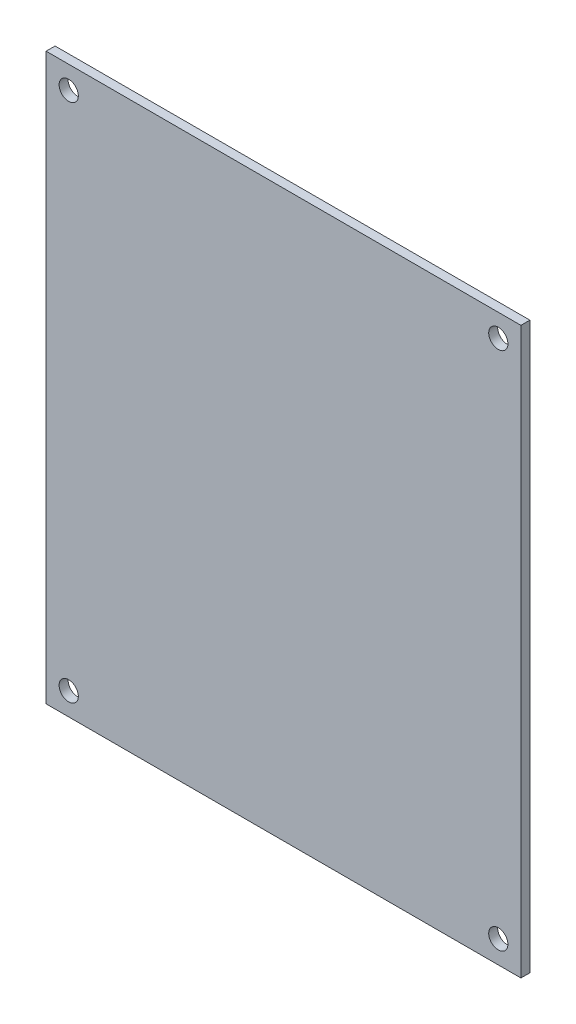
ISO-10303-21;
HEADER;
FILE_DESCRIPTION(('STEP AP214'),'2;1');
FILE_NAME('part.step','',(''),(''),'','','');
FILE_SCHEMA(('AUTOMOTIVE_DESIGN { 1 0 10303 214 1 1 1 1 }'));
ENDSEC;
DATA;
#1=APPLICATION_CONTEXT('core data for automotive mechanical design processes');
#2=APPLICATION_PROTOCOL_DEFINITION('international standard','automotive_design',2000,#1);
#3=PRODUCT_CONTEXT('',#1,'mechanical');
#4=PRODUCT('Part','Part','',(#3));
#5=PRODUCT_RELATED_PRODUCT_CATEGORY('part','',(#4));
#6=PRODUCT_DEFINITION_FORMATION('','',#4);
#7=PRODUCT_DEFINITION_CONTEXT('part definition',#1,'design');
#8=PRODUCT_DEFINITION('design','',#6,#7);
#9=PRODUCT_DEFINITION_SHAPE('','',#8);
#10=(LENGTH_UNIT() NAMED_UNIT(*) SI_UNIT(.MILLI.,.METRE.));
#11=(NAMED_UNIT(*) PLANE_ANGLE_UNIT() SI_UNIT($,.RADIAN.));
#12=(NAMED_UNIT(*) SI_UNIT($,.STERADIAN.) SOLID_ANGLE_UNIT());
#13=UNCERTAINTY_MEASURE_WITH_UNIT(LENGTH_MEASURE(1.E-05),#10,'distance_accuracy_value','');
#14=(GEOMETRIC_REPRESENTATION_CONTEXT(3) GLOBAL_UNCERTAINTY_ASSIGNED_CONTEXT((#13)) GLOBAL_UNIT_ASSIGNED_CONTEXT((#10,
#11,#12)) REPRESENTATION_CONTEXT('',''));
#15=CARTESIAN_POINT('',(0.,0.,0.));
#16=DIRECTION('',(0.,0.,1.));
#17=DIRECTION('',(1.,0.,0.));
#18=AXIS2_PLACEMENT_3D('',#15,#16,#17);
#19=CARTESIAN_POINT('',(41.999999947,-49.999999949,-0.79375));
#20=DIRECTION('',(0.,0.,1.));
#21=DIRECTION('',(1.,0.,0.));
#22=AXIS2_PLACEMENT_3D('',#19,#20,#21);
#23=PLANE('',#22);
#24=CARTESIAN_POINT('',(-37.999999819,-45.999999821,-0.79375));
#25=DIRECTION('',(0.,0.,1.));
#26=DIRECTION('',(1.,0.,0.));
#27=AXIS2_PLACEMENT_3D('',#24,#25,#26);
#28=CIRCLE('',#27,1.700000029);
#29=CARTESIAN_POINT('',(-36.29999979,-45.999999821,-0.79375));
#30=VERTEX_POINT('',#29);
#31=EDGE_CURVE('E121',#30,#30,#28,.T.);
#32=ORIENTED_EDGE('',*,*,#31,.T.);
#33=EDGE_LOOP('',(#32));
#34=FACE_BOUND('',#33,.T.);
#35=CARTESIAN_POINT('',(37.999999819,-45.999999821,-0.79375));
#36=DIRECTION('',(0.,0.,1.));
#37=DIRECTION('',(1.,0.,0.));
#38=AXIS2_PLACEMENT_3D('',#35,#36,#37);
#39=CIRCLE('',#38,1.700000029);
#40=CARTESIAN_POINT('',(39.699999848,-45.999999821,-0.79375));
#41=VERTEX_POINT('',#40);
#42=EDGE_CURVE('E127',#41,#41,#39,.T.);
#43=ORIENTED_EDGE('',*,*,#42,.T.);
#44=EDGE_LOOP('',(#43));
#45=FACE_BOUND('',#44,.T.);
#46=CARTESIAN_POINT('',(37.999999819,45.999999821,-0.79375));
#47=DIRECTION('',(0.,0.,1.));
#48=DIRECTION('',(1.,0.,0.));
#49=AXIS2_PLACEMENT_3D('',#46,#47,#48);
#50=CIRCLE('',#49,1.700000029);
#51=CARTESIAN_POINT('',(39.699999848,45.999999821,-0.79375));
#52=VERTEX_POINT('',#51);
#53=EDGE_CURVE('E115',#52,#52,#50,.T.);
#54=ORIENTED_EDGE('',*,*,#53,.T.);
#55=EDGE_LOOP('',(#54));
#56=FACE_BOUND('',#55,.T.);
#57=CARTESIAN_POINT('',(-37.999999819,45.999999821,-0.79375));
#58=DIRECTION('',(0.,0.,1.));
#59=DIRECTION('',(1.,0.,0.));
#60=AXIS2_PLACEMENT_3D('',#57,#58,#59);
#61=CIRCLE('',#60,1.700000029);
#62=CARTESIAN_POINT('',(-36.29999979,45.999999821,-0.79375));
#63=VERTEX_POINT('',#62);
#64=EDGE_CURVE('E101',#63,#63,#61,.T.);
#65=ORIENTED_EDGE('',*,*,#64,.T.);
#66=EDGE_LOOP('',(#65));
#67=FACE_BOUND('',#66,.T.);
#68=DIRECTION('',(0.,1.,0.));
#69=VECTOR('',#68,1.);
#70=CARTESIAN_POINT('',(-41.999999947,-49.999999949,-0.79375));
#71=LINE('',#70,#69);
#72=CARTESIAN_POINT('',(-41.999999947,-49.999999949,-0.79375));
#73=VERTEX_POINT('',#72);
#74=CARTESIAN_POINT('',(-41.999999947,49.999999949,-0.79375));
#75=VERTEX_POINT('',#74);
#76=EDGE_CURVE('E98',#73,#75,#71,.T.);
#77=ORIENTED_EDGE('',*,*,#76,.T.);
#78=DIRECTION('',(-1.,0.,0.));
#79=VECTOR('',#78,1.);
#80=CARTESIAN_POINT('',(41.999999947,49.999999949,-0.79375));
#81=LINE('',#80,#79);
#82=CARTESIAN_POINT('',(41.999999947,49.999999949,-0.79375));
#83=VERTEX_POINT('',#82);
#84=EDGE_CURVE('E11',#83,#75,#81,.T.);
#85=ORIENTED_EDGE('',*,*,#84,.F.);
#86=DIRECTION('',(0.,1.,0.));
#87=VECTOR('',#86,1.);
#88=CARTESIAN_POINT('',(41.999999947,-49.999999949,-0.79375));
#89=LINE('',#88,#87);
#90=CARTESIAN_POINT('',(41.999999947,-49.999999949,-0.79375));
#91=VERTEX_POINT('',#90);
#92=EDGE_CURVE('E86',#91,#83,#89,.T.);
#93=ORIENTED_EDGE('',*,*,#92,.F.);
#94=DIRECTION('',(-1.,0.,0.));
#95=VECTOR('',#94,1.);
#96=CARTESIAN_POINT('',(41.999999947,-49.999999949,-0.79375));
#97=LINE('',#96,#95);
#98=EDGE_CURVE('E94',#91,#73,#97,.T.);
#99=ORIENTED_EDGE('',*,*,#98,.T.);
#100=EDGE_LOOP('',(#77,#85,#93,#99));
#101=FACE_BOUND('',#100,.T.);
#102=ADVANCED_FACE('F35',(#34,#45,#56,#67,#101),#23,.F.);
#103=CARTESIAN_POINT('',(41.999999947,49.999999949,0.79375));
#104=DIRECTION('',(0.,-1.,0.));
#105=DIRECTION('',(0.,0.,-1.));
#106=AXIS2_PLACEMENT_3D('',#103,#104,#105);
#107=PLANE('',#106);
#108=DIRECTION('',(0.,0.,1.));
#109=VECTOR('',#108,1.);
#110=CARTESIAN_POINT('',(-41.999999947,49.999999949,0.79375));
#111=LINE('',#110,#109);
#112=CARTESIAN_POINT('',(-41.999999947,49.999999949,0.79375));
#113=VERTEX_POINT('',#112);
#114=EDGE_CURVE('E90',#75,#113,#111,.T.);
#115=ORIENTED_EDGE('',*,*,#114,.T.);
#116=DIRECTION('',(-1.,0.,0.));
#117=VECTOR('',#116,1.);
#118=CARTESIAN_POINT('',(41.999999947,49.999999949,0.79375));
#119=LINE('',#118,#117);
#120=CARTESIAN_POINT('',(41.999999947,49.999999949,0.79375));
#121=VERTEX_POINT('',#120);
#122=EDGE_CURVE('E43',#121,#113,#119,.T.);
#123=ORIENTED_EDGE('',*,*,#122,.F.);
#124=DIRECTION('',(0.,0.,1.));
#125=VECTOR('',#124,1.);
#126=CARTESIAN_POINT('',(41.999999947,49.999999949,0.79375));
#127=LINE('',#126,#125);
#128=EDGE_CURVE('E81',#83,#121,#127,.T.);
#129=ORIENTED_EDGE('',*,*,#128,.F.);
#130=ORIENTED_EDGE('',*,*,#84,.T.);
#131=EDGE_LOOP('',(#115,#123,#129,#130));
#132=FACE_BOUND('',#131,.T.);
#133=ADVANCED_FACE('F89',(#132),#107,.F.);
#134=CARTESIAN_POINT('',(41.999999947,-49.999999949,0.79375));
#135=DIRECTION('',(0.,0.,-1.));
#136=DIRECTION('',(-1.,0.,0.));
#137=AXIS2_PLACEMENT_3D('',#134,#135,#136);
#138=PLANE('',#137);
#139=CARTESIAN_POINT('',(-37.999999819,-45.999999821,0.79375));
#140=DIRECTION('',(0.,0.,1.));
#141=DIRECTION('',(1.,0.,0.));
#142=AXIS2_PLACEMENT_3D('',#139,#140,#141);
#143=CIRCLE('',#142,1.700000029);
#144=CARTESIAN_POINT('',(-36.29999979,-45.999999821,0.79375));
#145=VERTEX_POINT('',#144);
#146=EDGE_CURVE('E118',#145,#145,#143,.T.);
#147=ORIENTED_EDGE('',*,*,#146,.F.);
#148=EDGE_LOOP('',(#147));
#149=FACE_BOUND('',#148,.T.);
#150=CARTESIAN_POINT('',(37.999999819,-45.999999821,0.79375));
#151=DIRECTION('',(0.,0.,1.));
#152=DIRECTION('',(1.,0.,0.));
#153=AXIS2_PLACEMENT_3D('',#150,#151,#152);
#154=CIRCLE('',#153,1.700000029);
#155=CARTESIAN_POINT('',(39.699999848,-45.999999821,0.79375));
#156=VERTEX_POINT('',#155);
#157=EDGE_CURVE('E124',#156,#156,#154,.T.);
#158=ORIENTED_EDGE('',*,*,#157,.F.);
#159=EDGE_LOOP('',(#158));
#160=FACE_BOUND('',#159,.T.);
#161=CARTESIAN_POINT('',(37.999999819,45.999999821,0.79375));
#162=DIRECTION('',(0.,0.,1.));
#163=DIRECTION('',(1.,0.,0.));
#164=AXIS2_PLACEMENT_3D('',#161,#162,#163);
#165=CIRCLE('',#164,1.700000029);
#166=CARTESIAN_POINT('',(39.699999848,45.999999821,0.79375));
#167=VERTEX_POINT('',#166);
#168=EDGE_CURVE('E130',#167,#167,#165,.T.);
#169=ORIENTED_EDGE('',*,*,#168,.F.);
#170=EDGE_LOOP('',(#169));
#171=FACE_BOUND('',#170,.T.);
#172=CARTESIAN_POINT('',(-37.999999819,45.999999821,0.79375));
#173=DIRECTION('',(0.,0.,1.));
#174=DIRECTION('',(1.,0.,0.));
#175=AXIS2_PLACEMENT_3D('',#172,#173,#174);
#176=CIRCLE('',#175,1.700000029);
#177=CARTESIAN_POINT('',(-36.29999979,45.999999821,0.79375));
#178=VERTEX_POINT('',#177);
#179=EDGE_CURVE('E112',#178,#178,#176,.T.);
#180=ORIENTED_EDGE('',*,*,#179,.F.);
#181=EDGE_LOOP('',(#180));
#182=FACE_BOUND('',#181,.T.);
#183=DIRECTION('',(0.,-1.,0.));
#184=VECTOR('',#183,1.);
#185=CARTESIAN_POINT('',(-41.999999947,-49.999999949,0.79375));
#186=LINE('',#185,#184);
#187=CARTESIAN_POINT('',(-41.999999947,-49.999999949,0.79375));
#188=VERTEX_POINT('',#187);
#189=EDGE_CURVE('E68',#113,#188,#186,.T.);
#190=ORIENTED_EDGE('',*,*,#189,.T.);
#191=DIRECTION('',(-1.,0.,0.));
#192=VECTOR('',#191,1.);
#193=CARTESIAN_POINT('',(41.999999947,-49.999999949,0.79375));
#194=LINE('',#193,#192);
#195=CARTESIAN_POINT('',(41.999999947,-49.999999949,0.79375));
#196=VERTEX_POINT('',#195);
#197=EDGE_CURVE('E91',#196,#188,#194,.T.);
#198=ORIENTED_EDGE('',*,*,#197,.F.);
#199=DIRECTION('',(0.,-1.,0.));
#200=VECTOR('',#199,1.);
#201=CARTESIAN_POINT('',(41.999999947,-49.999999949,0.79375));
#202=LINE('',#201,#200);
#203=EDGE_CURVE('E84',#121,#196,#202,.T.);
#204=ORIENTED_EDGE('',*,*,#203,.F.);
#205=ORIENTED_EDGE('',*,*,#122,.T.);
#206=EDGE_LOOP('',(#190,#198,#204,#205));
#207=FACE_BOUND('',#206,.T.);
#208=ADVANCED_FACE('F92',(#149,#160,#171,#182,#207),#138,.F.);
#209=CARTESIAN_POINT('',(41.999999947,-49.999999949,0.79375));
#210=DIRECTION('',(0.,1.,0.));
#211=DIRECTION('',(0.,0.,1.));
#212=AXIS2_PLACEMENT_3D('',#209,#210,#211);
#213=PLANE('',#212);
#214=DIRECTION('',(0.,0.,-1.));
#215=VECTOR('',#214,1.);
#216=CARTESIAN_POINT('',(-41.999999947,-49.999999949,0.79375));
#217=LINE('',#216,#215);
#218=EDGE_CURVE('E74',#188,#73,#217,.T.);
#219=ORIENTED_EDGE('',*,*,#218,.T.);
#220=ORIENTED_EDGE('',*,*,#98,.F.);
#221=DIRECTION('',(0.,0.,-1.));
#222=VECTOR('',#221,1.);
#223=CARTESIAN_POINT('',(41.999999947,-49.999999949,0.79375));
#224=LINE('',#223,#222);
#225=EDGE_CURVE('E51',#196,#91,#224,.T.);
#226=ORIENTED_EDGE('',*,*,#225,.F.);
#227=ORIENTED_EDGE('',*,*,#197,.T.);
#228=EDGE_LOOP('',(#219,#220,#226,#227));
#229=FACE_BOUND('',#228,.T.);
#230=ADVANCED_FACE('F106',(#229),#213,.F.);
#231=CARTESIAN_POINT('',(41.999999947,0.,0.));
#232=DIRECTION('',(-1.,0.,0.));
#233=DIRECTION('',(0.,0.,1.));
#234=AXIS2_PLACEMENT_3D('',#231,#232,#233);
#235=PLANE('',#234);
#236=ORIENTED_EDGE('',*,*,#92,.T.);
#237=ORIENTED_EDGE('',*,*,#128,.T.);
#238=ORIENTED_EDGE('',*,*,#203,.T.);
#239=ORIENTED_EDGE('',*,*,#225,.T.);
#240=EDGE_LOOP('',(#236,#237,#238,#239));
#241=FACE_BOUND('',#240,.T.);
#242=ADVANCED_FACE('F82',(#241),#235,.F.);
#243=CARTESIAN_POINT('',(-41.999999947,0.,0.));
#244=DIRECTION('',(-1.,0.,0.));
#245=DIRECTION('',(0.,0.,1.));
#246=AXIS2_PLACEMENT_3D('',#243,#244,#245);
#247=PLANE('',#246);
#248=ORIENTED_EDGE('',*,*,#76,.F.);
#249=ORIENTED_EDGE('',*,*,#218,.F.);
#250=ORIENTED_EDGE('',*,*,#189,.F.);
#251=ORIENTED_EDGE('',*,*,#114,.F.);
#252=EDGE_LOOP('',(#248,#249,#250,#251));
#253=FACE_BOUND('',#252,.T.);
#254=ADVANCED_FACE('F109',(#253),#247,.T.);
#255=CARTESIAN_POINT('',(-37.999999819,45.999999821,-0.79375));
#256=DIRECTION('',(0.,0.,1.));
#257=DIRECTION('',(1.,0.,0.));
#258=AXIS2_PLACEMENT_3D('',#255,#256,#257);
#259=CYLINDRICAL_SURFACE('',#258,1.700000029);
#260=ORIENTED_EDGE('',*,*,#64,.F.);
#261=EDGE_LOOP('',(#260));
#262=FACE_BOUND('',#261,.T.);
#263=ORIENTED_EDGE('',*,*,#179,.T.);
#264=EDGE_LOOP('',(#263));
#265=FACE_BOUND('',#264,.T.);
#266=ADVANCED_FACE('F142',(#262,#265),#259,.F.);
#267=CARTESIAN_POINT('',(37.999999819,45.999999821,-0.79375));
#268=DIRECTION('',(0.,0.,1.));
#269=DIRECTION('',(1.,0.,0.));
#270=AXIS2_PLACEMENT_3D('',#267,#268,#269);
#271=CYLINDRICAL_SURFACE('',#270,1.700000029);
#272=ORIENTED_EDGE('',*,*,#53,.F.);
#273=EDGE_LOOP('',(#272));
#274=FACE_BOUND('',#273,.T.);
#275=ORIENTED_EDGE('',*,*,#168,.T.);
#276=EDGE_LOOP('',(#275));
#277=FACE_BOUND('',#276,.T.);
#278=ADVANCED_FACE('F138',(#274,#277),#271,.F.);
#279=CARTESIAN_POINT('',(37.999999819,-45.999999821,-0.79375));
#280=DIRECTION('',(0.,0.,1.));
#281=DIRECTION('',(1.,0.,0.));
#282=AXIS2_PLACEMENT_3D('',#279,#280,#281);
#283=CYLINDRICAL_SURFACE('',#282,1.700000029);
#284=ORIENTED_EDGE('',*,*,#42,.F.);
#285=EDGE_LOOP('',(#284));
#286=FACE_BOUND('',#285,.T.);
#287=ORIENTED_EDGE('',*,*,#157,.T.);
#288=EDGE_LOOP('',(#287));
#289=FACE_BOUND('',#288,.T.);
#290=ADVANCED_FACE('F141',(#286,#289),#283,.F.);
#291=CARTESIAN_POINT('',(-37.999999819,-45.999999821,-0.79375));
#292=DIRECTION('',(0.,0.,1.));
#293=DIRECTION('',(1.,0.,0.));
#294=AXIS2_PLACEMENT_3D('',#291,#292,#293);
#295=CYLINDRICAL_SURFACE('',#294,1.700000029);
#296=ORIENTED_EDGE('',*,*,#31,.F.);
#297=EDGE_LOOP('',(#296));
#298=FACE_BOUND('',#297,.T.);
#299=ORIENTED_EDGE('',*,*,#146,.T.);
#300=EDGE_LOOP('',(#299));
#301=FACE_BOUND('',#300,.T.);
#302=ADVANCED_FACE('F173',(#298,#301),#295,.F.);
#303=CLOSED_SHELL('',(#102,#133,#208,#230,#242,#254,#266,#278,#290,#302));
#304=MANIFOLD_SOLID_BREP('B2',#303);
#305=ADVANCED_BREP_SHAPE_REPRESENTATION('',(#18,#304),#14);
#306=SHAPE_DEFINITION_REPRESENTATION(#9,#305);
ENDSEC;
END-ISO-10303-21;
